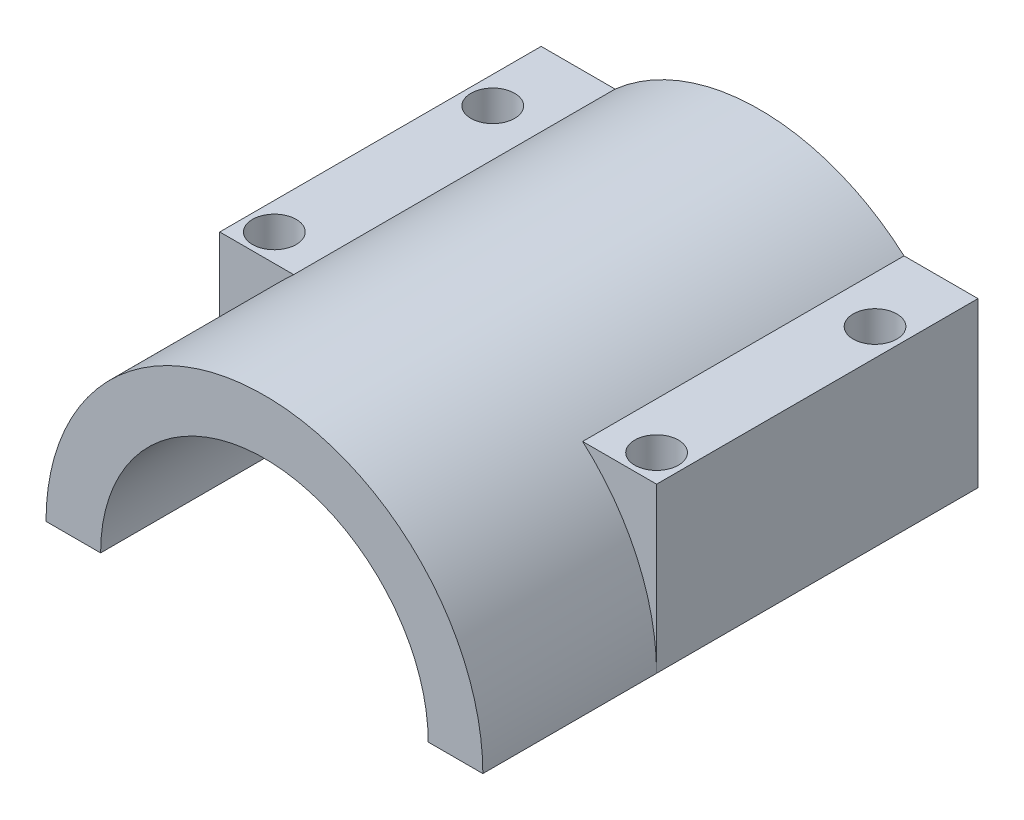
ISO-10303-21;
HEADER;
FILE_DESCRIPTION(('STEP AP214'),'2;1');
FILE_NAME('part.step','',(''),(''),'','','');
FILE_SCHEMA(('AUTOMOTIVE_DESIGN { 1 0 10303 214 1 1 1 1 }'));
ENDSEC;
DATA;
#1=APPLICATION_CONTEXT('core data for automotive mechanical design processes');
#2=APPLICATION_PROTOCOL_DEFINITION('international standard','automotive_design',2000,#1);
#3=PRODUCT_CONTEXT('',#1,'mechanical');
#4=PRODUCT('Part','Part','',(#3));
#5=PRODUCT_RELATED_PRODUCT_CATEGORY('part','',(#4));
#6=PRODUCT_DEFINITION_FORMATION('','',#4);
#7=PRODUCT_DEFINITION_CONTEXT('part definition',#1,'design');
#8=PRODUCT_DEFINITION('design','',#6,#7);
#9=PRODUCT_DEFINITION_SHAPE('','',#8);
#10=(LENGTH_UNIT() NAMED_UNIT(*) SI_UNIT(.MILLI.,.METRE.));
#11=(NAMED_UNIT(*) PLANE_ANGLE_UNIT() SI_UNIT($,.RADIAN.));
#12=(NAMED_UNIT(*) SI_UNIT($,.STERADIAN.) SOLID_ANGLE_UNIT());
#13=UNCERTAINTY_MEASURE_WITH_UNIT(LENGTH_MEASURE(1.E-05),#10,'distance_accuracy_value','');
#14=(GEOMETRIC_REPRESENTATION_CONTEXT(3) GLOBAL_UNCERTAINTY_ASSIGNED_CONTEXT((#13)) GLOBAL_UNIT_ASSIGNED_CONTEXT((#10,
#11,#12)) REPRESENTATION_CONTEXT('',''));
#15=CARTESIAN_POINT('',(0.,0.,0.));
#16=DIRECTION('',(0.,0.,1.));
#17=DIRECTION('',(1.,0.,0.));
#18=AXIS2_PLACEMENT_3D('',#15,#16,#17);
#19=CARTESIAN_POINT('',(0.,0.,52.578));
#20=DIRECTION('',(0.,0.,-1.));
#21=DIRECTION('',(-1.,0.,0.));
#22=AXIS2_PLACEMENT_3D('',#19,#20,#21);
#23=CYLINDRICAL_SURFACE('',#22,25.4);
#24=DIRECTION('',(0.,0.,-1.));
#25=VECTOR('',#24,1.);
#26=CARTESIAN_POINT('',(25.4,0.,52.578));
#27=LINE('',#26,#25);
#28=CARTESIAN_POINT('',(25.4,0.,52.578));
#29=VERTEX_POINT('',#28);
#30=CARTESIAN_POINT('',(25.4,0.,32.375));
#31=VERTEX_POINT('',#30);
#32=EDGE_CURVE('E54',#29,#31,#27,.T.);
#33=ORIENTED_EDGE('',*,*,#32,.T.);
#34=CARTESIAN_POINT('',(0.,0.,32.375));
#35=DIRECTION('',(0.,0.,-1.));
#36=DIRECTION('',(-1.,0.,0.));
#37=AXIS2_PLACEMENT_3D('',#34,#35,#36);
#38=CIRCLE('',#37,25.4);
#39=CARTESIAN_POINT('',(16.8005208252601,19.05,32.375));
#40=VERTEX_POINT('',#39);
#41=EDGE_CURVE('E221',#31,#40,#38,.F.);
#42=ORIENTED_EDGE('',*,*,#41,.T.);
#43=DIRECTION('',(0.,0.,-1.));
#44=VECTOR('',#43,1.);
#45=CARTESIAN_POINT('',(16.8005208252601,19.05,52.578));
#46=LINE('',#45,#44);
#47=CARTESIAN_POINT('',(16.8005208252601,19.05,-5.));
#48=VERTEX_POINT('',#47);
#49=EDGE_CURVE('E239',#48,#40,#46,.F.);
#50=ORIENTED_EDGE('',*,*,#49,.F.);
#51=CARTESIAN_POINT('',(0.,0.,-5.));
#52=DIRECTION('',(0.,0.,-1.));
#53=DIRECTION('',(-1.,0.,0.));
#54=AXIS2_PLACEMENT_3D('',#51,#52,#53);
#55=CIRCLE('',#54,25.4);
#56=CARTESIAN_POINT('',(-16.8005208252601,19.05,-5.));
#57=VERTEX_POINT('',#56);
#58=EDGE_CURVE('E163',#57,#48,#55,.T.);
#59=ORIENTED_EDGE('',*,*,#58,.F.);
#60=DIRECTION('',(0.,0.,-1.));
#61=VECTOR('',#60,1.);
#62=CARTESIAN_POINT('',(-16.8005208252601,19.05,52.578));
#63=LINE('',#62,#61);
#64=CARTESIAN_POINT('',(-16.8005208252601,19.05,32.375));
#65=VERTEX_POINT('',#64);
#66=EDGE_CURVE('E61',#65,#57,#63,.T.);
#67=ORIENTED_EDGE('',*,*,#66,.F.);
#68=CARTESIAN_POINT('',(0.,0.,32.375));
#69=DIRECTION('',(0.,0.,1.));
#70=DIRECTION('',(1.,0.,0.));
#71=AXIS2_PLACEMENT_3D('',#68,#69,#70);
#72=CIRCLE('',#71,25.4);
#73=CARTESIAN_POINT('',(-25.4,0.,32.375));
#74=VERTEX_POINT('',#73);
#75=EDGE_CURVE('E209',#74,#65,#72,.F.);
#76=ORIENTED_EDGE('',*,*,#75,.F.);
#77=DIRECTION('',(0.,0.,-1.));
#78=VECTOR('',#77,1.);
#79=CARTESIAN_POINT('',(-25.4,0.,52.578));
#80=LINE('',#79,#78);
#81=CARTESIAN_POINT('',(-25.4,0.,52.578));
#82=VERTEX_POINT('',#81);
#83=EDGE_CURVE('E119',#82,#74,#80,.T.);
#84=ORIENTED_EDGE('',*,*,#83,.F.);
#85=CARTESIAN_POINT('',(0.,0.,52.578));
#86=DIRECTION('',(0.,0.,1.));
#87=DIRECTION('',(-1.,0.,0.));
#88=AXIS2_PLACEMENT_3D('',#85,#86,#87);
#89=CIRCLE('',#88,25.4);
#90=EDGE_CURVE('E101',#29,#82,#89,.T.);
#91=ORIENTED_EDGE('',*,*,#90,.F.);
#92=EDGE_LOOP('',(#33,#42,#50,#59,#67,#76,#84,#91));
#93=FACE_BOUND('',#92,.T.);
#94=ADVANCED_FACE('F45',(#93),#23,.T.);
#95=CARTESIAN_POINT('',(0.,0.,52.578));
#96=DIRECTION('',(0.,0.,-1.));
#97=DIRECTION('',(-1.,0.,0.));
#98=AXIS2_PLACEMENT_3D('',#95,#96,#97);
#99=CYLINDRICAL_SURFACE('',#98,19.05);
#100=CARTESIAN_POINT('',(0.,0.,0.));
#101=DIRECTION('',(0.,0.,-1.));
#102=DIRECTION('',(1.,0.,0.));
#103=AXIS2_PLACEMENT_3D('',#100,#101,#102);
#104=CIRCLE('',#103,19.05);
#105=CARTESIAN_POINT('',(-19.05,0.,0.));
#106=VERTEX_POINT('',#105);
#107=CARTESIAN_POINT('',(19.05,0.,0.));
#108=VERTEX_POINT('',#107);
#109=EDGE_CURVE('E126',#106,#108,#104,.T.);
#110=ORIENTED_EDGE('',*,*,#109,.T.);
#111=DIRECTION('',(0.,0.,-1.));
#112=VECTOR('',#111,1.);
#113=CARTESIAN_POINT('',(19.05,0.,52.578));
#114=LINE('',#113,#112);
#115=CARTESIAN_POINT('',(19.05,0.,52.578));
#116=VERTEX_POINT('',#115);
#117=EDGE_CURVE('E11',#116,#108,#114,.T.);
#118=ORIENTED_EDGE('',*,*,#117,.F.);
#119=CARTESIAN_POINT('',(0.,0.,52.578));
#120=DIRECTION('',(0.,0.,-1.));
#121=DIRECTION('',(1.,0.,0.));
#122=AXIS2_PLACEMENT_3D('',#119,#120,#121);
#123=CIRCLE('',#122,19.05);
#124=CARTESIAN_POINT('',(-19.05,0.,52.578));
#125=VERTEX_POINT('',#124);
#126=EDGE_CURVE('E103',#125,#116,#123,.T.);
#127=ORIENTED_EDGE('',*,*,#126,.F.);
#128=DIRECTION('',(0.,0.,-1.));
#129=VECTOR('',#128,1.);
#130=CARTESIAN_POINT('',(-19.05,0.,52.578));
#131=LINE('',#130,#129);
#132=EDGE_CURVE('E90',#125,#106,#131,.T.);
#133=ORIENTED_EDGE('',*,*,#132,.T.);
#134=EDGE_LOOP('',(#110,#118,#127,#133));
#135=FACE_BOUND('',#134,.T.);
#136=ADVANCED_FACE('F47',(#135),#99,.F.);
#137=CARTESIAN_POINT('',(-19.05,0.,52.578));
#138=DIRECTION('',(0.,1.,0.));
#139=DIRECTION('',(0.,0.,1.));
#140=AXIS2_PLACEMENT_3D('',#137,#138,#139);
#141=PLANE('',#140);
#142=ORIENTED_EDGE('',*,*,#83,.T.);
#143=CARTESIAN_POINT('',(-25.4,0.,-5.));
#144=VERTEX_POINT('',#143);
#145=EDGE_CURVE('E132',#74,#144,#80,.T.);
#146=ORIENTED_EDGE('',*,*,#145,.T.);
#147=DIRECTION('',(-1.,0.,0.));
#148=VECTOR('',#147,1.);
#149=CARTESIAN_POINT('',(25.4,0.,-5.));
#150=LINE('',#149,#148);
#151=CARTESIAN_POINT('',(25.4,0.,-5.));
#152=VERTEX_POINT('',#151);
#153=EDGE_CURVE('E129',#152,#144,#150,.T.);
#154=ORIENTED_EDGE('',*,*,#153,.F.);
#155=EDGE_CURVE('E113',#31,#152,#27,.T.);
#156=ORIENTED_EDGE('',*,*,#155,.F.);
#157=ORIENTED_EDGE('',*,*,#32,.F.);
#158=DIRECTION('',(1.,0.,0.));
#159=VECTOR('',#158,1.);
#160=CARTESIAN_POINT('',(19.05,0.,52.578));
#161=LINE('',#160,#159);
#162=EDGE_CURVE('E97',#116,#29,#161,.T.);
#163=ORIENTED_EDGE('',*,*,#162,.F.);
#164=ORIENTED_EDGE('',*,*,#117,.T.);
#165=DIRECTION('',(-1.,0.,0.));
#166=VECTOR('',#165,1.);
#167=CARTESIAN_POINT('',(25.4,0.,0.));
#168=LINE('',#167,#166);
#169=EDGE_CURVE('E167',#108,#106,#168,.T.);
#170=ORIENTED_EDGE('',*,*,#169,.T.);
#171=ORIENTED_EDGE('',*,*,#132,.F.);
#172=DIRECTION('',(1.,0.,0.));
#173=VECTOR('',#172,1.);
#174=CARTESIAN_POINT('',(-19.05,0.,52.578));
#175=LINE('',#174,#173);
#176=EDGE_CURVE('E70',#82,#125,#175,.T.);
#177=ORIENTED_EDGE('',*,*,#176,.F.);
#178=EDGE_LOOP('',(#142,#146,#154,#156,#157,#163,#164,#170,#171,#177));
#179=FACE_BOUND('',#178,.T.);
#180=CARTESIAN_POINT('',(-22.225,0.,29.2));
#181=DIRECTION('',(0.,1.,0.));
#182=DIRECTION('',(0.,0.,1.));
#183=AXIS2_PLACEMENT_3D('',#180,#181,#182);
#184=CIRCLE('',#183,2.54);
#185=CARTESIAN_POINT('',(-22.225,0.,31.74));
#186=VERTEX_POINT('',#185);
#187=EDGE_CURVE('E188',#186,#186,#184,.T.);
#188=ORIENTED_EDGE('',*,*,#187,.T.);
#189=EDGE_LOOP('',(#188));
#190=FACE_BOUND('',#189,.T.);
#191=CARTESIAN_POINT('',(-22.225,0.,3.8));
#192=DIRECTION('',(0.,1.,0.));
#193=DIRECTION('',(0.,0.,1.));
#194=AXIS2_PLACEMENT_3D('',#191,#192,#193);
#195=CIRCLE('',#194,2.54);
#196=CARTESIAN_POINT('',(-22.225,0.,6.34));
#197=VERTEX_POINT('',#196);
#198=EDGE_CURVE('E182',#197,#197,#195,.T.);
#199=ORIENTED_EDGE('',*,*,#198,.T.);
#200=EDGE_LOOP('',(#199));
#201=FACE_BOUND('',#200,.T.);
#202=CARTESIAN_POINT('',(22.225,0.,3.8));
#203=DIRECTION('',(0.,1.,0.));
#204=DIRECTION('',(0.,0.,1.));
#205=AXIS2_PLACEMENT_3D('',#202,#203,#204);
#206=CIRCLE('',#205,2.54);
#207=CARTESIAN_POINT('',(22.225,0.,6.34));
#208=VERTEX_POINT('',#207);
#209=EDGE_CURVE('E187',#208,#208,#206,.T.);
#210=ORIENTED_EDGE('',*,*,#209,.T.);
#211=EDGE_LOOP('',(#210));
#212=FACE_BOUND('',#211,.T.);
#213=CARTESIAN_POINT('',(22.225,0.,29.2));
#214=DIRECTION('',(0.,1.,0.));
#215=DIRECTION('',(0.,0.,1.));
#216=AXIS2_PLACEMENT_3D('',#213,#214,#215);
#217=CIRCLE('',#216,2.54);
#218=CARTESIAN_POINT('',(22.225,0.,31.74));
#219=VERTEX_POINT('',#218);
#220=EDGE_CURVE('E192',#219,#219,#217,.T.);
#221=ORIENTED_EDGE('',*,*,#220,.T.);
#222=EDGE_LOOP('',(#221));
#223=FACE_BOUND('',#222,.T.);
#224=ADVANCED_FACE('F109',(#179,#190,#201,#212,#223),#141,.F.);
#225=CARTESIAN_POINT('',(0.,0.,52.578));
#226=DIRECTION('',(0.,0.,1.));
#227=DIRECTION('',(1.,0.,0.));
#228=AXIS2_PLACEMENT_3D('',#225,#226,#227);
#229=PLANE('',#228);
#230=ORIENTED_EDGE('',*,*,#126,.T.);
#231=ORIENTED_EDGE('',*,*,#162,.T.);
#232=ORIENTED_EDGE('',*,*,#90,.T.);
#233=ORIENTED_EDGE('',*,*,#176,.T.);
#234=EDGE_LOOP('',(#230,#231,#232,#233));
#235=FACE_BOUND('',#234,.T.);
#236=ADVANCED_FACE('F99',(#235),#229,.T.);
#237=CARTESIAN_POINT('',(0.,0.,0.));
#238=DIRECTION('',(0.,0.,-1.));
#239=DIRECTION('',(-1.,0.,0.));
#240=AXIS2_PLACEMENT_3D('',#237,#238,#239);
#241=PLANE('',#240);
#242=CARTESIAN_POINT('',(0.,7.,0.));
#243=DIRECTION('',(0.,0.,-1.));
#244=DIRECTION('',(-1.,0.,0.));
#245=AXIS2_PLACEMENT_3D('',#242,#243,#244);
#246=CIRCLE('',#245,6.);
#247=CARTESIAN_POINT('',(-6.,7.,0.));
#248=VERTEX_POINT('',#247);
#249=EDGE_CURVE('E176',#248,#248,#246,.T.);
#250=ORIENTED_EDGE('',*,*,#249,.T.);
#251=EDGE_LOOP('',(#250));
#252=FACE_BOUND('',#251,.T.);
#253=ORIENTED_EDGE('',*,*,#109,.F.);
#254=ORIENTED_EDGE('',*,*,#169,.F.);
#255=EDGE_LOOP('',(#253,#254));
#256=FACE_BOUND('',#255,.T.);
#257=ADVANCED_FACE('F319',(#252,#256),#241,.F.);
#258=CARTESIAN_POINT('',(0.,0.,-5.));
#259=DIRECTION('',(0.,0.,-1.));
#260=DIRECTION('',(-1.,0.,0.));
#261=AXIS2_PLACEMENT_3D('',#258,#259,#260);
#262=PLANE('',#261);
#263=ORIENTED_EDGE('',*,*,#153,.T.);
#264=DIRECTION('',(0.,1.,0.));
#265=VECTOR('',#264,1.);
#266=CARTESIAN_POINT('',(-25.4,-19.3023288750347,-5.));
#267=LINE('',#266,#265);
#268=CARTESIAN_POINT('',(-25.4,19.05,-5.));
#269=VERTEX_POINT('',#268);
#270=EDGE_CURVE('E147',#144,#269,#267,.T.);
#271=ORIENTED_EDGE('',*,*,#270,.T.);
#272=DIRECTION('',(-1.,0.,0.));
#273=VECTOR('',#272,1.);
#274=CARTESIAN_POINT('',(-16.51,19.05,-5.));
#275=LINE('',#274,#273);
#276=EDGE_CURVE('E216',#57,#269,#275,.T.);
#277=ORIENTED_EDGE('',*,*,#276,.F.);
#278=ORIENTED_EDGE('',*,*,#58,.T.);
#279=DIRECTION('',(1.,0.,0.));
#280=VECTOR('',#279,1.);
#281=CARTESIAN_POINT('',(16.51,19.05,-5.));
#282=LINE('',#281,#280);
#283=CARTESIAN_POINT('',(25.4,19.05,-5.));
#284=VERTEX_POINT('',#283);
#285=EDGE_CURVE('E236',#48,#284,#282,.T.);
#286=ORIENTED_EDGE('',*,*,#285,.T.);
#287=DIRECTION('',(0.,1.,0.));
#288=VECTOR('',#287,1.);
#289=CARTESIAN_POINT('',(25.4,-19.3023288750347,-5.));
#290=LINE('',#289,#288);
#291=EDGE_CURVE('E161',#152,#284,#290,.T.);
#292=ORIENTED_EDGE('',*,*,#291,.F.);
#293=EDGE_LOOP('',(#263,#271,#277,#278,#286,#292));
#294=FACE_BOUND('',#293,.T.);
#295=CARTESIAN_POINT('',(0.,7.,-5.));
#296=DIRECTION('',(0.,0.,-1.));
#297=DIRECTION('',(-1.,0.,0.));
#298=AXIS2_PLACEMENT_3D('',#295,#296,#297);
#299=CIRCLE('',#298,6.);
#300=CARTESIAN_POINT('',(-6.,7.,-5.));
#301=VERTEX_POINT('',#300);
#302=EDGE_CURVE('E172',#301,#301,#299,.T.);
#303=ORIENTED_EDGE('',*,*,#302,.F.);
#304=EDGE_LOOP('',(#303));
#305=FACE_BOUND('',#304,.T.);
#306=ADVANCED_FACE('F157',(#294,#305),#262,.T.);
#307=CARTESIAN_POINT('',(0.,7.,-5.));
#308=DIRECTION('',(0.,0.,1.));
#309=DIRECTION('',(1.,0.,0.));
#310=AXIS2_PLACEMENT_3D('',#307,#308,#309);
#311=CYLINDRICAL_SURFACE('',#310,6.);
#312=ORIENTED_EDGE('',*,*,#302,.T.);
#313=EDGE_LOOP('',(#312));
#314=FACE_BOUND('',#313,.T.);
#315=ORIENTED_EDGE('',*,*,#249,.F.);
#316=EDGE_LOOP('',(#315));
#317=FACE_BOUND('',#316,.T.);
#318=ADVANCED_FACE('F305',(#314,#317),#311,.F.);
#319=CARTESIAN_POINT('',(-22.225,25.4,3.8));
#320=DIRECTION('',(0.,-1.,0.));
#321=DIRECTION('',(0.,0.,-1.));
#322=AXIS2_PLACEMENT_3D('',#319,#320,#321);
#323=CYLINDRICAL_SURFACE('',#322,2.54);
#324=ORIENTED_EDGE('',*,*,#198,.F.);
#325=EDGE_LOOP('',(#324));
#326=FACE_BOUND('',#325,.T.);
#327=CARTESIAN_POINT('',(-22.225,19.05,3.8));
#328=DIRECTION('',(0.,-1.,0.));
#329=DIRECTION('',(0.,0.,-1.));
#330=AXIS2_PLACEMENT_3D('',#327,#328,#329);
#331=CIRCLE('',#330,2.54);
#332=CARTESIAN_POINT('',(-22.225,19.05,1.26));
#333=VERTEX_POINT('',#332);
#334=EDGE_CURVE('E203',#333,#333,#331,.T.);
#335=ORIENTED_EDGE('',*,*,#334,.F.);
#336=EDGE_LOOP('',(#335));
#337=FACE_BOUND('',#336,.T.);
#338=ADVANCED_FACE('F294',(#326,#337),#323,.F.);
#339=CARTESIAN_POINT('',(22.225,25.4,3.8));
#340=DIRECTION('',(0.,-1.,0.));
#341=DIRECTION('',(0.,0.,-1.));
#342=AXIS2_PLACEMENT_3D('',#339,#340,#341);
#343=CYLINDRICAL_SURFACE('',#342,2.54);
#344=ORIENTED_EDGE('',*,*,#209,.F.);
#345=EDGE_LOOP('',(#344));
#346=FACE_BOUND('',#345,.T.);
#347=CARTESIAN_POINT('',(22.225,19.05,3.8));
#348=DIRECTION('',(0.,-1.,0.));
#349=DIRECTION('',(0.,0.,-1.));
#350=AXIS2_PLACEMENT_3D('',#347,#348,#349);
#351=CIRCLE('',#350,2.54);
#352=CARTESIAN_POINT('',(22.225,19.05,1.26));
#353=VERTEX_POINT('',#352);
#354=EDGE_CURVE('E208',#353,#353,#351,.T.);
#355=ORIENTED_EDGE('',*,*,#354,.F.);
#356=EDGE_LOOP('',(#355));
#357=FACE_BOUND('',#356,.T.);
#358=ADVANCED_FACE('F291',(#346,#357),#343,.F.);
#359=CARTESIAN_POINT('',(22.225,25.4,29.2));
#360=DIRECTION('',(0.,-1.,0.));
#361=DIRECTION('',(0.,0.,-1.));
#362=AXIS2_PLACEMENT_3D('',#359,#360,#361);
#363=CYLINDRICAL_SURFACE('',#362,2.54);
#364=ORIENTED_EDGE('',*,*,#220,.F.);
#365=EDGE_LOOP('',(#364));
#366=FACE_BOUND('',#365,.T.);
#367=CARTESIAN_POINT('',(22.225,19.05,29.2));
#368=DIRECTION('',(0.,-1.,0.));
#369=DIRECTION('',(0.,0.,-1.));
#370=AXIS2_PLACEMENT_3D('',#367,#368,#369);
#371=CIRCLE('',#370,2.54);
#372=CARTESIAN_POINT('',(22.225,19.05,26.66));
#373=VERTEX_POINT('',#372);
#374=EDGE_CURVE('E204',#373,#373,#371,.T.);
#375=ORIENTED_EDGE('',*,*,#374,.F.);
#376=EDGE_LOOP('',(#375));
#377=FACE_BOUND('',#376,.T.);
#378=ADVANCED_FACE('F293',(#366,#377),#363,.F.);
#379=CARTESIAN_POINT('',(-22.225,25.4,29.2));
#380=DIRECTION('',(0.,-1.,0.));
#381=DIRECTION('',(0.,0.,-1.));
#382=AXIS2_PLACEMENT_3D('',#379,#380,#381);
#383=CYLINDRICAL_SURFACE('',#382,2.54);
#384=ORIENTED_EDGE('',*,*,#187,.F.);
#385=EDGE_LOOP('',(#384));
#386=FACE_BOUND('',#385,.T.);
#387=CARTESIAN_POINT('',(-22.225,19.05,29.2));
#388=DIRECTION('',(0.,-1.,0.));
#389=DIRECTION('',(0.,0.,-1.));
#390=AXIS2_PLACEMENT_3D('',#387,#388,#389);
#391=CIRCLE('',#390,2.54);
#392=CARTESIAN_POINT('',(-22.225,19.05,26.66));
#393=VERTEX_POINT('',#392);
#394=EDGE_CURVE('E193',#393,#393,#391,.T.);
#395=ORIENTED_EDGE('',*,*,#394,.F.);
#396=EDGE_LOOP('',(#395));
#397=FACE_BOUND('',#396,.T.);
#398=ADVANCED_FACE('F301',(#386,#397),#383,.F.);
#399=CARTESIAN_POINT('',(-22.225,19.05,3.8));
#400=DIRECTION('',(0.,-1.,0.));
#401=DIRECTION('',(0.,0.,-1.));
#402=AXIS2_PLACEMENT_3D('',#399,#400,#401);
#403=PLANE('',#402);
#404=ORIENTED_EDGE('',*,*,#334,.T.);
#405=EDGE_LOOP('',(#404));
#406=FACE_BOUND('',#405,.T.);
#407=ORIENTED_EDGE('',*,*,#276,.T.);
#408=DIRECTION('',(0.,0.,1.));
#409=VECTOR('',#408,1.);
#410=CARTESIAN_POINT('',(-25.4,19.05,32.375));
#411=LINE('',#410,#409);
#412=CARTESIAN_POINT('',(-25.4,19.05,32.375));
#413=VERTEX_POINT('',#412);
#414=EDGE_CURVE('E151',#269,#413,#411,.T.);
#415=ORIENTED_EDGE('',*,*,#414,.T.);
#416=DIRECTION('',(1.,0.,0.));
#417=VECTOR('',#416,1.);
#418=CARTESIAN_POINT('',(-16.51,19.05,32.375));
#419=LINE('',#418,#417);
#420=EDGE_CURVE('E219',#413,#65,#419,.T.);
#421=ORIENTED_EDGE('',*,*,#420,.T.);
#422=ORIENTED_EDGE('',*,*,#66,.T.);
#423=EDGE_LOOP('',(#407,#415,#421,#422));
#424=FACE_BOUND('',#423,.T.);
#425=ORIENTED_EDGE('',*,*,#394,.T.);
#426=EDGE_LOOP('',(#425));
#427=FACE_BOUND('',#426,.T.);
#428=ADVANCED_FACE('F276',(#406,#424,#427),#403,.F.);
#429=CARTESIAN_POINT('',(22.225,19.05,29.2));
#430=DIRECTION('',(0.,-1.,0.));
#431=DIRECTION('',(0.,0.,-1.));
#432=AXIS2_PLACEMENT_3D('',#429,#430,#431);
#433=PLANE('',#432);
#434=ORIENTED_EDGE('',*,*,#374,.T.);
#435=EDGE_LOOP('',(#434));
#436=FACE_BOUND('',#435,.T.);
#437=DIRECTION('',(-1.,0.,0.));
#438=VECTOR('',#437,1.);
#439=CARTESIAN_POINT('',(16.51,19.05,32.375));
#440=LINE('',#439,#438);
#441=CARTESIAN_POINT('',(25.4,19.05,32.375));
#442=VERTEX_POINT('',#441);
#443=EDGE_CURVE('E246',#442,#40,#440,.T.);
#444=ORIENTED_EDGE('',*,*,#443,.F.);
#445=DIRECTION('',(0.,0.,1.));
#446=VECTOR('',#445,1.);
#447=CARTESIAN_POINT('',(25.4,19.05,32.375));
#448=LINE('',#447,#446);
#449=EDGE_CURVE('E242',#284,#442,#448,.T.);
#450=ORIENTED_EDGE('',*,*,#449,.F.);
#451=ORIENTED_EDGE('',*,*,#285,.F.);
#452=ORIENTED_EDGE('',*,*,#49,.T.);
#453=EDGE_LOOP('',(#444,#450,#451,#452));
#454=FACE_BOUND('',#453,.T.);
#455=ORIENTED_EDGE('',*,*,#354,.T.);
#456=EDGE_LOOP('',(#455));
#457=FACE_BOUND('',#456,.T.);
#458=ADVANCED_FACE('F284',(#436,#454,#457),#433,.F.);
#459=CARTESIAN_POINT('',(-16.51,-19.3023288750347,32.375));
#460=DIRECTION('',(0.,0.,1.));
#461=DIRECTION('',(1.,0.,0.));
#462=AXIS2_PLACEMENT_3D('',#459,#460,#461);
#463=PLANE('',#462);
#464=ORIENTED_EDGE('',*,*,#75,.T.);
#465=ORIENTED_EDGE('',*,*,#420,.F.);
#466=DIRECTION('',(0.,1.,0.));
#467=VECTOR('',#466,1.);
#468=CARTESIAN_POINT('',(-25.4,-19.3023288750347,32.375));
#469=LINE('',#468,#467);
#470=EDGE_CURVE('E154',#74,#413,#469,.T.);
#471=ORIENTED_EDGE('',*,*,#470,.F.);
#472=EDGE_LOOP('',(#464,#465,#471));
#473=FACE_BOUND('',#472,.T.);
#474=ADVANCED_FACE('F280',(#473),#463,.T.);
#475=CARTESIAN_POINT('',(-25.4,-19.3023288750347,32.375));
#476=DIRECTION('',(-1.,0.,0.));
#477=DIRECTION('',(0.,0.,1.));
#478=AXIS2_PLACEMENT_3D('',#475,#476,#477);
#479=PLANE('',#478);
#480=ORIENTED_EDGE('',*,*,#414,.F.);
#481=ORIENTED_EDGE('',*,*,#270,.F.);
#482=ORIENTED_EDGE('',*,*,#145,.F.);
#483=ORIENTED_EDGE('',*,*,#470,.T.);
#484=EDGE_LOOP('',(#480,#481,#482,#483));
#485=FACE_BOUND('',#484,.T.);
#486=ADVANCED_FACE('F148',(#485),#479,.T.);
#487=CARTESIAN_POINT('',(16.51,-19.3023288750347,32.375));
#488=DIRECTION('',(0.,0.,-1.));
#489=DIRECTION('',(-1.,0.,0.));
#490=AXIS2_PLACEMENT_3D('',#487,#488,#489);
#491=PLANE('',#490);
#492=ORIENTED_EDGE('',*,*,#41,.F.);
#493=DIRECTION('',(0.,1.,0.));
#494=VECTOR('',#493,1.);
#495=CARTESIAN_POINT('',(25.4,-19.3023288750347,32.375));
#496=LINE('',#495,#494);
#497=EDGE_CURVE('E232',#31,#442,#496,.T.);
#498=ORIENTED_EDGE('',*,*,#497,.T.);
#499=ORIENTED_EDGE('',*,*,#443,.T.);
#500=EDGE_LOOP('',(#492,#498,#499));
#501=FACE_BOUND('',#500,.T.);
#502=ADVANCED_FACE('F261',(#501),#491,.F.);
#503=CARTESIAN_POINT('',(25.4,-19.3023288750347,32.375));
#504=DIRECTION('',(-1.,0.,0.));
#505=DIRECTION('',(0.,0.,1.));
#506=AXIS2_PLACEMENT_3D('',#503,#504,#505);
#507=PLANE('',#506);
#508=ORIENTED_EDGE('',*,*,#155,.T.);
#509=ORIENTED_EDGE('',*,*,#291,.T.);
#510=ORIENTED_EDGE('',*,*,#449,.T.);
#511=ORIENTED_EDGE('',*,*,#497,.F.);
#512=EDGE_LOOP('',(#508,#509,#510,#511));
#513=FACE_BOUND('',#512,.T.);
#514=ADVANCED_FACE('F283',(#513),#507,.F.);
#515=CLOSED_SHELL('',(#94,#136,#224,#236,#257,#306,#318,#338,#358,#378,#398,#428,#458,#474,#486,
#502,#514));
#516=MANIFOLD_SOLID_BREP('B2',#515);
#517=ADVANCED_BREP_SHAPE_REPRESENTATION('',(#18,#516),#14);
#518=SHAPE_DEFINITION_REPRESENTATION(#9,#517);
ENDSEC;
END-ISO-10303-21;
